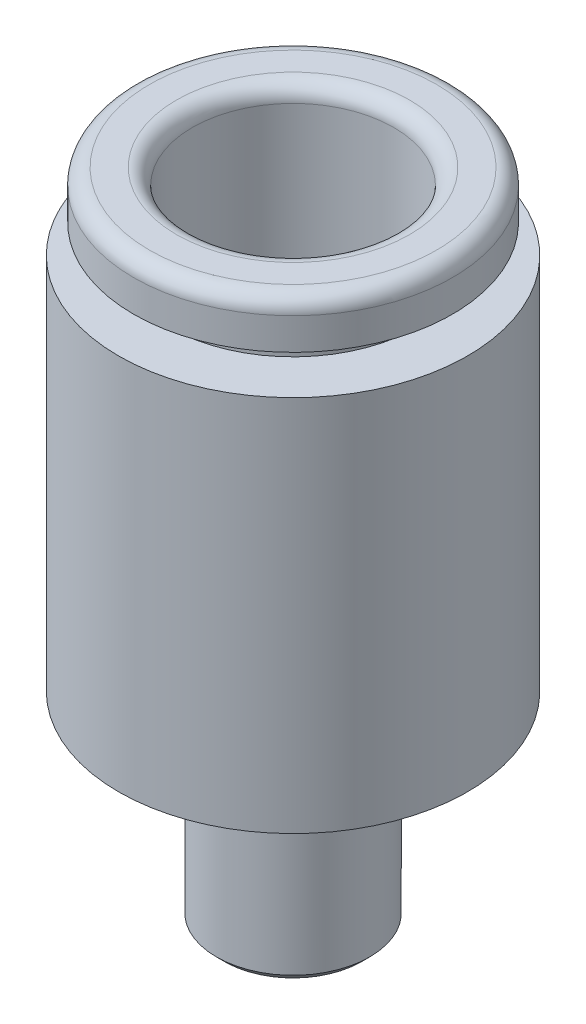
ISO-10303-21;
HEADER;
FILE_DESCRIPTION(('STEP AP214'),'2;1');
FILE_NAME('part.step','',(''),(''),'','','');
FILE_SCHEMA(('AUTOMOTIVE_DESIGN { 1 0 10303 214 1 1 1 1 }'));
ENDSEC;
DATA;
#1=APPLICATION_CONTEXT('core data for automotive mechanical design processes');
#2=APPLICATION_PROTOCOL_DEFINITION('international standard','automotive_design',2000,#1);
#3=PRODUCT_CONTEXT('',#1,'mechanical');
#4=PRODUCT('Part','Part','',(#3));
#5=PRODUCT_RELATED_PRODUCT_CATEGORY('part','',(#4));
#6=PRODUCT_DEFINITION_FORMATION('','',#4);
#7=PRODUCT_DEFINITION_CONTEXT('part definition',#1,'design');
#8=PRODUCT_DEFINITION('design','',#6,#7);
#9=PRODUCT_DEFINITION_SHAPE('','',#8);
#10=(LENGTH_UNIT() NAMED_UNIT(*) SI_UNIT(.MILLI.,.METRE.));
#11=(NAMED_UNIT(*) PLANE_ANGLE_UNIT() SI_UNIT($,.RADIAN.));
#12=(NAMED_UNIT(*) SI_UNIT($,.STERADIAN.) SOLID_ANGLE_UNIT());
#13=UNCERTAINTY_MEASURE_WITH_UNIT(LENGTH_MEASURE(1.E-05),#10,'distance_accuracy_value','');
#14=(GEOMETRIC_REPRESENTATION_CONTEXT(3) GLOBAL_UNCERTAINTY_ASSIGNED_CONTEXT((#13)) GLOBAL_UNIT_ASSIGNED_CONTEXT((#10,
#11,#12)) REPRESENTATION_CONTEXT('',''));
#15=CARTESIAN_POINT('',(0.,0.,0.));
#16=DIRECTION('',(0.,0.,1.));
#17=DIRECTION('',(1.,0.,0.));
#18=AXIS2_PLACEMENT_3D('',#15,#16,#17);
#19=CARTESIAN_POINT('',(0.577350269189625,-15.3,1.));
#20=DIRECTION('',(0.,-1.,0.));
#21=DIRECTION('',(0.,0.,-1.));
#22=AXIS2_PLACEMENT_3D('',#19,#20,#21);
#23=PLANE('',#22);
#24=DIRECTION('',(-1.,0.,0.));
#25=VECTOR('',#24,1.);
#26=CARTESIAN_POINT('',(0.577350269189627,-15.3,-0.930158461016504));
#27=LINE('',#26,#25);
#28=CARTESIAN_POINT('',(0.537027237856888,-15.3,-0.930158461016504));
#29=VERTEX_POINT('',#28);
#30=CARTESIAN_POINT('',(0.,-15.3,-0.930158461016503));
#31=VERTEX_POINT('',#30);
#32=EDGE_CURVE('E146',#29,#31,#27,.T.);
#33=ORIENTED_EDGE('',*,*,#32,.T.);
#34=CARTESIAN_POINT('',(0.,-15.3,0.));
#35=DIRECTION('',(0.,-1.,0.));
#36=DIRECTION('',(0.,0.,-1.));
#37=AXIS2_PLACEMENT_3D('',#34,#35,#36);
#38=CIRCLE('',#37,0.930158461016504);
#39=CARTESIAN_POINT('',(0.80554085678533,-15.3,-0.465079230508252));
#40=VERTEX_POINT('',#39);
#41=EDGE_CURVE('E11',#31,#40,#38,.T.);
#42=ORIENTED_EDGE('',*,*,#41,.T.);
#43=DIRECTION('',(-0.5,0.,-0.866025403784439));
#44=VECTOR('',#43,1.);
#45=CARTESIAN_POINT('',(1.09421599138014,-15.3,0.0349207694917481));
#46=LINE('',#45,#44);
#47=EDGE_CURVE('E153',#40,#29,#46,.T.);
#48=ORIENTED_EDGE('',*,*,#47,.T.);
#49=EDGE_LOOP('',(#33,#42,#48));
#50=FACE_BOUND('',#49,.T.);
#51=ADVANCED_FACE('F34',(#50),#23,.F.);
#52=CARTESIAN_POINT('',(1.07405447571377,-15.3,0.));
#53=VERTEX_POINT('',#52);
#54=EDGE_CURVE('E150',#53,#40,#46,.T.);
#55=ORIENTED_EDGE('',*,*,#54,.T.);
#56=CARTESIAN_POINT('',(0.80554085678533,-15.3,0.465079230508252));
#57=VERTEX_POINT('',#56);
#58=EDGE_CURVE('E43',#40,#57,#38,.T.);
#59=ORIENTED_EDGE('',*,*,#58,.T.);
#60=DIRECTION('',(0.5,0.,-0.866025403784438));
#61=VECTOR('',#60,1.);
#62=CARTESIAN_POINT('',(0.516865722190517,-15.3,0.965079230508253));
#63=LINE('',#62,#61);
#64=EDGE_CURVE('E224',#57,#53,#63,.T.);
#65=ORIENTED_EDGE('',*,*,#64,.T.);
#66=EDGE_LOOP('',(#55,#59,#65));
#67=FACE_BOUND('',#66,.T.);
#68=ADVANCED_FACE('F248',(#67),#23,.F.);
#69=CARTESIAN_POINT('',(0.537027237856886,-15.3,0.930158461016505));
#70=VERTEX_POINT('',#69);
#71=EDGE_CURVE('E120',#70,#57,#63,.T.);
#72=ORIENTED_EDGE('',*,*,#71,.T.);
#73=CARTESIAN_POINT('',(0.,-15.3,0.));
#74=DIRECTION('',(0.,1.,0.));
#75=DIRECTION('',(0.,0.,1.));
#76=AXIS2_PLACEMENT_3D('',#73,#74,#75);
#77=CIRCLE('',#76,0.930158461016504);
#78=CARTESIAN_POINT('',(0.,-15.3,0.930158461016504));
#79=VERTEX_POINT('',#78);
#80=EDGE_CURVE('E106',#79,#57,#77,.T.);
#81=ORIENTED_EDGE('',*,*,#80,.F.);
#82=DIRECTION('',(1.,0.,0.));
#83=VECTOR('',#82,1.);
#84=CARTESIAN_POINT('',(-0.577350269189628,-15.3,0.930158461016504));
#85=LINE('',#84,#83);
#86=EDGE_CURVE('E117',#79,#70,#85,.T.);
#87=ORIENTED_EDGE('',*,*,#86,.T.);
#88=EDGE_LOOP('',(#72,#81,#87));
#89=FACE_BOUND('',#88,.T.);
#90=ADVANCED_FACE('F116',(#89),#23,.F.);
#91=CARTESIAN_POINT('',(-0.537027237856889,-15.3,0.930158461016504));
#92=VERTEX_POINT('',#91);
#93=EDGE_CURVE('E127',#92,#79,#85,.T.);
#94=ORIENTED_EDGE('',*,*,#93,.T.);
#95=CARTESIAN_POINT('',(-0.80554085678533,-15.3,0.465079230508252));
#96=VERTEX_POINT('',#95);
#97=EDGE_CURVE('E103',#79,#96,#38,.T.);
#98=ORIENTED_EDGE('',*,*,#97,.T.);
#99=DIRECTION('',(0.5,0.,0.866025403784439));
#100=VECTOR('',#99,1.);
#101=CARTESIAN_POINT('',(-1.09421599138014,-15.3,-0.0349207694917461));
#102=LINE('',#101,#100);
#103=EDGE_CURVE('E132',#96,#92,#102,.T.);
#104=ORIENTED_EDGE('',*,*,#103,.T.);
#105=EDGE_LOOP('',(#94,#98,#104));
#106=FACE_BOUND('',#105,.T.);
#107=ADVANCED_FACE('F131',(#106),#23,.F.);
#108=CARTESIAN_POINT('',(-1.07405447571377,-15.3,0.));
#109=VERTEX_POINT('',#108);
#110=EDGE_CURVE('E129',#109,#96,#102,.T.);
#111=ORIENTED_EDGE('',*,*,#110,.T.);
#112=CARTESIAN_POINT('',(-0.80554085678533,-15.3,-0.465079230508252));
#113=VERTEX_POINT('',#112);
#114=EDGE_CURVE('E109',#96,#113,#38,.T.);
#115=ORIENTED_EDGE('',*,*,#114,.T.);
#116=DIRECTION('',(-0.5,0.,0.866025403784439));
#117=VECTOR('',#116,1.);
#118=CARTESIAN_POINT('',(-0.516865722190519,-15.3,-0.965079230508251));
#119=LINE('',#118,#117);
#120=EDGE_CURVE('E145',#113,#109,#119,.T.);
#121=ORIENTED_EDGE('',*,*,#120,.T.);
#122=EDGE_LOOP('',(#111,#115,#121));
#123=FACE_BOUND('',#122,.T.);
#124=ADVANCED_FACE('F197',(#123),#23,.F.);
#125=CARTESIAN_POINT('',(0.,0.,0.));
#126=DIRECTION('',(0.,1.,0.));
#127=DIRECTION('',(0.,0.,1.));
#128=AXIS2_PLACEMENT_3D('',#125,#126,#127);
#129=CYLINDRICAL_SURFACE('',#128,3.925);
#130=CARTESIAN_POINT('',(0.,-2.4,0.));
#131=DIRECTION('',(0.,1.,0.));
#132=DIRECTION('',(0.,0.,1.));
#133=AXIS2_PLACEMENT_3D('',#130,#131,#132);
#134=CIRCLE('',#133,3.925);
#135=CARTESIAN_POINT('',(0.,-2.4,3.925));
#136=VERTEX_POINT('',#135);
#137=EDGE_CURVE('E166',#136,#136,#134,.F.);
#138=ORIENTED_EDGE('',*,*,#137,.F.);
#139=EDGE_LOOP('',(#138));
#140=FACE_BOUND('',#139,.T.);
#141=CARTESIAN_POINT('',(0.,-1.5,0.));
#142=DIRECTION('',(0.,1.,0.));
#143=DIRECTION('',(0.,0.,1.));
#144=AXIS2_PLACEMENT_3D('',#141,#142,#143);
#145=CIRCLE('',#144,3.925);
#146=CARTESIAN_POINT('',(0.,-1.5,3.925));
#147=VERTEX_POINT('',#146);
#148=EDGE_CURVE('E178',#147,#147,#145,.T.);
#149=ORIENTED_EDGE('',*,*,#148,.F.);
#150=EDGE_LOOP('',(#149));
#151=FACE_BOUND('',#150,.T.);
#152=ADVANCED_FACE('F312',(#140,#151),#129,.T.);
#153=CARTESIAN_POINT('',(-5.025,-1.5,0.));
#154=DIRECTION('',(0.,-1.,0.));
#155=DIRECTION('',(0.,0.,-1.));
#156=AXIS2_PLACEMENT_3D('',#153,#154,#155);
#157=PLANE('',#156);
#158=ORIENTED_EDGE('',*,*,#148,.T.);
#159=EDGE_LOOP('',(#158));
#160=FACE_BOUND('',#159,.T.);
#161=CARTESIAN_POINT('',(0.,-1.5,0.));
#162=DIRECTION('',(0.,1.,0.));
#163=DIRECTION('',(0.,0.,1.));
#164=AXIS2_PLACEMENT_3D('',#161,#162,#163);
#165=CIRCLE('',#164,5.025);
#166=CARTESIAN_POINT('',(0.,-1.5,5.025));
#167=VERTEX_POINT('',#166);
#168=EDGE_CURVE('E175',#167,#167,#165,.T.);
#169=ORIENTED_EDGE('',*,*,#168,.F.);
#170=EDGE_LOOP('',(#169));
#171=FACE_BOUND('',#170,.T.);
#172=ADVANCED_FACE('F308',(#160,#171),#157,.T.);
#173=CARTESIAN_POINT('',(0.,0.,0.));
#174=DIRECTION('',(0.,1.,0.));
#175=DIRECTION('',(0.,0.,1.));
#176=AXIS2_PLACEMENT_3D('',#173,#174,#175);
#177=CYLINDRICAL_SURFACE('',#176,5.025);
#178=ORIENTED_EDGE('',*,*,#168,.T.);
#179=EDGE_LOOP('',(#178));
#180=FACE_BOUND('',#179,.T.);
#181=CARTESIAN_POINT('',(0.,-0.500000000000001,0.));
#182=DIRECTION('',(0.,1.,0.));
#183=DIRECTION('',(0.,0.,1.));
#184=AXIS2_PLACEMENT_3D('',#181,#182,#183);
#185=CIRCLE('',#184,5.025);
#186=CARTESIAN_POINT('',(0.,-0.500000000000001,5.025));
#187=VERTEX_POINT('',#186);
#188=EDGE_CURVE('E172',#187,#187,#185,.T.);
#189=ORIENTED_EDGE('',*,*,#188,.F.);
#190=EDGE_LOOP('',(#189));
#191=FACE_BOUND('',#190,.T.);
#192=ADVANCED_FACE('F304',(#180,#191),#177,.T.);
#193=CARTESIAN_POINT('',(0.,-0.500000000000001,0.));
#194=DIRECTION('',(0.,1.,0.));
#195=DIRECTION('',(0.,0.,1.));
#196=AXIS2_PLACEMENT_3D('',#193,#194,#195);
#197=TOROIDAL_SURFACE('',#196,4.525,0.5);
#198=ORIENTED_EDGE('',*,*,#188,.T.);
#199=EDGE_LOOP('',(#198));
#200=FACE_BOUND('',#199,.T.);
#201=CARTESIAN_POINT('',(0.,0.,0.));
#202=DIRECTION('',(0.,1.,0.));
#203=DIRECTION('',(0.,0.,1.));
#204=AXIS2_PLACEMENT_3D('',#201,#202,#203);
#205=CIRCLE('',#204,4.525);
#206=CARTESIAN_POINT('',(0.,0.,4.525));
#207=VERTEX_POINT('',#206);
#208=EDGE_CURVE('E169',#207,#207,#205,.T.);
#209=ORIENTED_EDGE('',*,*,#208,.F.);
#210=EDGE_LOOP('',(#209));
#211=FACE_BOUND('',#210,.T.);
#212=ADVANCED_FACE('F301',(#200,#211),#197,.T.);
#213=CARTESIAN_POINT('',(0.,0.,0.));
#214=DIRECTION('',(0.,1.,0.));
#215=DIRECTION('',(0.,0.,1.));
#216=AXIS2_PLACEMENT_3D('',#213,#214,#215);
#217=PLANE('',#216);
#218=CARTESIAN_POINT('',(0.,0.,0.));
#219=DIRECTION('',(0.,1.,0.));
#220=DIRECTION('',(0.,0.,1.));
#221=AXIS2_PLACEMENT_3D('',#218,#219,#220);
#222=CIRCLE('',#221,3.675);
#223=CARTESIAN_POINT('',(0.,0.,3.675));
#224=VERTEX_POINT('',#223);
#225=EDGE_CURVE('E189',#224,#224,#222,.F.);
#226=ORIENTED_EDGE('',*,*,#225,.T.);
#227=EDGE_LOOP('',(#226));
#228=FACE_BOUND('',#227,.T.);
#229=ORIENTED_EDGE('',*,*,#208,.T.);
#230=EDGE_LOOP('',(#229));
#231=FACE_BOUND('',#230,.T.);
#232=ADVANCED_FACE('F297',(#228,#231),#217,.T.);
#233=CARTESIAN_POINT('',(0.,-29.856349186104,0.));
#234=DIRECTION('',(0.,1.,0.));
#235=DIRECTION('',(0.,0.,1.));
#236=AXIS2_PLACEMENT_3D('',#233,#234,#235);
#237=CYLINDRICAL_SURFACE('',#236,5.5);
#238=CARTESIAN_POINT('',(0.,-14.3,0.));
#239=DIRECTION('',(0.,1.,0.));
#240=DIRECTION('',(0.,0.,1.));
#241=AXIS2_PLACEMENT_3D('',#238,#239,#240);
#242=CIRCLE('',#241,5.5);
#243=CARTESIAN_POINT('',(0.,-14.3,5.5));
#244=VERTEX_POINT('',#243);
#245=EDGE_CURVE('E163',#244,#244,#242,.F.);
#246=ORIENTED_EDGE('',*,*,#245,.F.);
#247=EDGE_LOOP('',(#246));
#248=FACE_BOUND('',#247,.T.);
#249=CARTESIAN_POINT('',(0.,-2.4,0.));
#250=DIRECTION('',(0.,1.,0.));
#251=DIRECTION('',(0.,0.,1.));
#252=AXIS2_PLACEMENT_3D('',#249,#250,#251);
#253=CIRCLE('',#252,5.5);
#254=CARTESIAN_POINT('',(0.,-2.4,5.5));
#255=VERTEX_POINT('',#254);
#256=EDGE_CURVE('E160',#255,#255,#253,.T.);
#257=ORIENTED_EDGE('',*,*,#256,.F.);
#258=EDGE_LOOP('',(#257));
#259=FACE_BOUND('',#258,.T.);
#260=ADVANCED_FACE('F293',(#248,#259),#237,.T.);
#261=CARTESIAN_POINT('',(0.,-2.4,0.));
#262=DIRECTION('',(0.,1.,0.));
#263=DIRECTION('',(0.,0.,1.));
#264=AXIS2_PLACEMENT_3D('',#261,#262,#263);
#265=PLANE('',#264);
#266=ORIENTED_EDGE('',*,*,#137,.T.);
#267=EDGE_LOOP('',(#266));
#268=FACE_BOUND('',#267,.T.);
#269=ORIENTED_EDGE('',*,*,#256,.T.);
#270=EDGE_LOOP('',(#269));
#271=FACE_BOUND('',#270,.T.);
#272=ADVANCED_FACE('F289',(#268,#271),#265,.T.);
#273=CARTESIAN_POINT('',(0.,-14.3,0.));
#274=DIRECTION('',(0.,1.,0.));
#275=DIRECTION('',(0.,0.,1.));
#276=AXIS2_PLACEMENT_3D('',#273,#274,#275);
#277=PLANE('',#276);
#278=CARTESIAN_POINT('',(0.,-14.3,0.));
#279=DIRECTION('',(0.,1.,0.));
#280=DIRECTION('',(0.,0.,1.));
#281=AXIS2_PLACEMENT_3D('',#278,#279,#280);
#282=CIRCLE('',#281,2.41500000000002);
#283=CARTESIAN_POINT('',(0.,-14.3,2.41500000000002));
#284=VERTEX_POINT('',#283);
#285=EDGE_CURVE('E157',#284,#284,#282,.T.);
#286=ORIENTED_EDGE('',*,*,#285,.T.);
#287=EDGE_LOOP('',(#286));
#288=FACE_BOUND('',#287,.T.);
#289=ORIENTED_EDGE('',*,*,#245,.T.);
#290=EDGE_LOOP('',(#289));
#291=FACE_BOUND('',#290,.T.);
#292=ADVANCED_FACE('F286',(#288,#291),#277,.F.);
#293=CARTESIAN_POINT('',(-2.415,-20.6,0.));
#294=DIRECTION('',(0.,-1.,0.));
#295=DIRECTION('',(0.,0.,-1.));
#296=AXIS2_PLACEMENT_3D('',#293,#294,#295);
#297=PLANE('',#296);
#298=CARTESIAN_POINT('',(0.,-20.6,0.));
#299=DIRECTION('',(0.,1.,0.));
#300=DIRECTION('',(0.,0.,1.));
#301=AXIS2_PLACEMENT_3D('',#298,#299,#300);
#302=CIRCLE('',#301,0.930158461016504);
#303=CARTESIAN_POINT('',(0.,-20.6,0.930158461016504));
#304=VERTEX_POINT('',#303);
#305=EDGE_CURVE('E121',#304,#304,#302,.T.);
#306=ORIENTED_EDGE('',*,*,#305,.T.);
#307=EDGE_LOOP('',(#306));
#308=FACE_BOUND('',#307,.T.);
#309=CARTESIAN_POINT('',(0.,-20.6,0.));
#310=DIRECTION('',(0.,-1.,0.));
#311=DIRECTION('',(0.,0.,-1.));
#312=AXIS2_PLACEMENT_3D('',#309,#310,#311);
#313=CIRCLE('',#312,2.165);
#314=CARTESIAN_POINT('',(0.,-20.6,-2.165));
#315=VERTEX_POINT('',#314);
#316=EDGE_CURVE('E184',#315,#315,#313,.T.);
#317=ORIENTED_EDGE('',*,*,#316,.T.);
#318=EDGE_LOOP('',(#317));
#319=FACE_BOUND('',#318,.T.);
#320=ADVANCED_FACE('F237',(#308,#319),#297,.T.);
#321=CARTESIAN_POINT('',(0.,0.,0.));
#322=DIRECTION('',(0.,1.,0.));
#323=DIRECTION('',(0.,0.,1.));
#324=AXIS2_PLACEMENT_3D('',#321,#322,#323);
#325=CYLINDRICAL_SURFACE('',#324,2.41500000000001);
#326=CARTESIAN_POINT('',(0.,-20.35,0.));
#327=DIRECTION('',(0.,-1.,0.));
#328=DIRECTION('',(0.,0.,-1.));
#329=AXIS2_PLACEMENT_3D('',#326,#327,#328);
#330=CIRCLE('',#329,2.41500000000001);
#331=CARTESIAN_POINT('',(0.,-20.35,-2.41500000000001));
#332=VERTEX_POINT('',#331);
#333=EDGE_CURVE('E181',#332,#332,#330,.F.);
#334=ORIENTED_EDGE('',*,*,#333,.T.);
#335=EDGE_LOOP('',(#334));
#336=FACE_BOUND('',#335,.T.);
#337=ORIENTED_EDGE('',*,*,#285,.F.);
#338=EDGE_LOOP('',(#337));
#339=FACE_BOUND('',#338,.T.);
#340=ADVANCED_FACE('F280',(#336,#339),#325,.T.);
#341=CARTESIAN_POINT('',(0.,-20.35,0.));
#342=DIRECTION('',(0.,1.,0.));
#343=DIRECTION('',(0.,0.,1.));
#344=AXIS2_PLACEMENT_3D('',#341,#342,#343);
#345=CONICAL_SURFACE('',#344,2.41500000000001,0.785398163397447);
#346=ORIENTED_EDGE('',*,*,#316,.F.);
#347=EDGE_LOOP('',(#346));
#348=FACE_BOUND('',#347,.T.);
#349=ORIENTED_EDGE('',*,*,#333,.F.);
#350=EDGE_LOOP('',(#349));
#351=FACE_BOUND('',#350,.T.);
#352=ADVANCED_FACE('F278',(#348,#351),#345,.T.);
#353=CARTESIAN_POINT('',(0.,-22.2802561210692,0.));
#354=DIRECTION('',(0.,1.,0.));
#355=DIRECTION('',(0.,0.,1.));
#356=AXIS2_PLACEMENT_3D('',#353,#354,#355);
#357=CYLINDRICAL_SURFACE('',#356,3.175);
#358=CARTESIAN_POINT('',(0.,-0.5,0.));
#359=DIRECTION('',(0.,1.,0.));
#360=DIRECTION('',(0.,0.,1.));
#361=AXIS2_PLACEMENT_3D('',#358,#359,#360);
#362=CIRCLE('',#361,3.175);
#363=CARTESIAN_POINT('',(0.,-0.5,3.175));
#364=VERTEX_POINT('',#363);
#365=EDGE_CURVE('E187',#364,#364,#362,.T.);
#366=CARTESIAN_POINT('',(0.,-13.3,0.));
#367=DIRECTION('',(0.,1.,0.));
#368=DIRECTION('',(0.,0.,1.));
#369=AXIS2_PLACEMENT_3D('',#366,#367,#368);
#370=CIRCLE('',#369,3.175);
#371=CARTESIAN_POINT('',(0.,-13.3,3.175));
#372=VERTEX_POINT('',#371);
#373=EDGE_CURVE('E154',#372,#372,#370,.F.);
#374=CARTESIAN_POINT('',(0.,-0.5,3.175));
#375=CARTESIAN_POINT('',(0.,-0.633333333333334,3.175));
#376=CARTESIAN_POINT('',(0.,-0.766666666666668,3.175));
#377=CARTESIAN_POINT('',(0.,-1.03333333333333,3.175));
#378=CARTESIAN_POINT('',(0.,-1.16666666666667,3.175));
#379=CARTESIAN_POINT('',(0.,-1.43333333333333,3.175));
#380=CARTESIAN_POINT('',(0.,-1.56666666666667,3.175));
#381=CARTESIAN_POINT('',(0.,-1.83333333333333,3.175));
#382=CARTESIAN_POINT('',(0.,-1.96666666666667,3.175));
#383=CARTESIAN_POINT('',(0.,-2.23333333333334,3.175));
#384=CARTESIAN_POINT('',(0.,-2.36666666666667,3.175));
#385=CARTESIAN_POINT('',(0.,-2.63333333333333,3.175));
#386=CARTESIAN_POINT('',(0.,-2.76666666666667,3.175));
#387=CARTESIAN_POINT('',(0.,-3.03333333333333,3.175));
#388=CARTESIAN_POINT('',(0.,-3.16666666666667,3.175));
#389=CARTESIAN_POINT('',(0.,-3.43333333333333,3.175));
#390=CARTESIAN_POINT('',(0.,-3.56666666666667,3.175));
#391=CARTESIAN_POINT('',(0.,-3.83333333333333,3.175));
#392=CARTESIAN_POINT('',(0.,-3.96666666666667,3.175));
#393=CARTESIAN_POINT('',(0.,-4.23333333333333,3.175));
#394=CARTESIAN_POINT('',(0.,-4.36666666666667,3.175));
#395=CARTESIAN_POINT('',(0.,-4.63333333333333,3.175));
#396=CARTESIAN_POINT('',(0.,-4.76666666666667,3.175));
#397=CARTESIAN_POINT('',(0.,-5.03333333333333,3.175));
#398=CARTESIAN_POINT('',(0.,-5.16666666666667,3.175));
#399=CARTESIAN_POINT('',(0.,-5.43333333333333,3.175));
#400=CARTESIAN_POINT('',(0.,-5.56666666666667,3.175));
#401=CARTESIAN_POINT('',(0.,-5.83333333333333,3.175));
#402=CARTESIAN_POINT('',(0.,-5.96666666666667,3.175));
#403=CARTESIAN_POINT('',(0.,-6.23333333333333,3.175));
#404=CARTESIAN_POINT('',(0.,-6.36666666666667,3.175));
#405=CARTESIAN_POINT('',(0.,-6.63333333333333,3.175));
#406=CARTESIAN_POINT('',(0.,-6.76666666666667,3.175));
#407=CARTESIAN_POINT('',(0.,-7.03333333333333,3.175));
#408=CARTESIAN_POINT('',(0.,-7.16666666666667,3.175));
#409=CARTESIAN_POINT('',(0.,-7.43333333333333,3.175));
#410=CARTESIAN_POINT('',(0.,-7.56666666666667,3.175));
#411=CARTESIAN_POINT('',(0.,-7.83333333333333,3.175));
#412=CARTESIAN_POINT('',(0.,-7.96666666666667,3.175));
#413=CARTESIAN_POINT('',(0.,-8.23333333333333,3.175));
#414=CARTESIAN_POINT('',(0.,-8.36666666666667,3.175));
#415=CARTESIAN_POINT('',(0.,-8.63333333333333,3.175));
#416=CARTESIAN_POINT('',(0.,-8.76666666666667,3.175));
#417=CARTESIAN_POINT('',(0.,-9.03333333333333,3.175));
#418=CARTESIAN_POINT('',(0.,-9.16666666666667,3.175));
#419=CARTESIAN_POINT('',(0.,-9.43333333333333,3.175));
#420=CARTESIAN_POINT('',(0.,-9.56666666666667,3.175));
#421=CARTESIAN_POINT('',(0.,-9.83333333333333,3.175));
#422=CARTESIAN_POINT('',(0.,-9.96666666666667,3.175));
#423=CARTESIAN_POINT('',(0.,-10.2333333333333,3.175));
#424=CARTESIAN_POINT('',(0.,-10.3666666666667,3.175));
#425=CARTESIAN_POINT('',(0.,-10.6333333333333,3.175));
#426=CARTESIAN_POINT('',(0.,-10.7666666666667,3.175));
#427=CARTESIAN_POINT('',(0.,-11.0333333333333,3.175));
#428=CARTESIAN_POINT('',(0.,-11.1666666666667,3.175));
#429=CARTESIAN_POINT('',(0.,-11.4333333333333,3.175));
#430=CARTESIAN_POINT('',(0.,-11.5666666666667,3.175));
#431=CARTESIAN_POINT('',(0.,-11.8333333333333,3.175));
#432=CARTESIAN_POINT('',(0.,-11.9666666666667,3.175));
#433=CARTESIAN_POINT('',(0.,-12.2333333333333,3.175));
#434=CARTESIAN_POINT('',(0.,-12.3666666666667,3.175));
#435=CARTESIAN_POINT('',(0.,-12.6333333333333,3.175));
#436=CARTESIAN_POINT('',(0.,-12.7666666666667,3.175));
#437=CARTESIAN_POINT('',(0.,-13.0333333333333,3.175));
#438=CARTESIAN_POINT('',(0.,-13.1666666666667,3.175));
#439=CARTESIAN_POINT('',(0.,-13.3,3.175));
#440=B_SPLINE_CURVE_WITH_KNOTS('',3,(#374,#375,#376,#377,#378,#379,#380,#381,#382,#383,#384,
#385,#386,#387,#388,#389,#390,#391,#392,#393,#394,#395,#396,#397,#398,#399,#400,#401,#402,#403,
#404,#405,#406,#407,#408,#409,#410,#411,#412,#413,#414,#415,#416,#417,#418,#419,#420,#421,#422,
#423,#424,#425,#426,#427,#428,#429,#430,#431,#432,#433,#434,#435,#436,#437,#438,#439),
.UNSPECIFIED.,.F.,.F.,(4,2,2,2,2,2,2,2,2,2,2,2,2,2,2,2,2,2,2,2,2,2,2,2,2,2,2,2,2,2,2,2,4),(0.,
0.400000000000001,0.799999999999999,1.2,1.6,2.,2.4,2.8,3.2,3.6,4.,4.4,4.8,5.2,5.6,6.,6.4,6.8,
7.2,7.6,8.,8.4,8.8,9.2,9.6,10.,10.4,10.8,11.2,11.6,12.,12.4,12.8),.UNSPECIFIED.);
#441=EDGE_CURVE('BSEAM274',#364,#372,#440,.T.);
#442=ORIENTED_EDGE('',*,*,#365,.T.);
#443=ORIENTED_EDGE('',*,*,#373,.T.);
#444=ORIENTED_EDGE('',*,*,#441,.T.);
#445=ORIENTED_EDGE('',*,*,#441,.F.);
#446=EDGE_LOOP('',(#442,#444,#443,#445));
#447=FACE_BOUND('',#446,.T.);
#448=ADVANCED_FACE('F274',(#447),#357,.F.);
#449=CARTESIAN_POINT('',(0.,-13.3,0.));
#450=DIRECTION('',(0.,1.,0.));
#451=DIRECTION('',(0.,0.,1.));
#452=AXIS2_PLACEMENT_3D('',#449,#450,#451);
#453=PLANE('',#452);
#454=DIRECTION('',(0.5,0.,-0.866025403784438));
#455=VECTOR('',#454,1.);
#456=CARTESIAN_POINT('',(0.577350269189625,-13.3,1.));
#457=LINE('',#456,#455);
#458=CARTESIAN_POINT('',(0.577350269189625,-13.3,1.));
#459=VERTEX_POINT('',#458);
#460=CARTESIAN_POINT('',(1.15470053837925,-13.3,0.));
#461=VERTEX_POINT('',#460);
#462=EDGE_CURVE('E56',#459,#461,#457,.T.);
#463=ORIENTED_EDGE('',*,*,#462,.F.);
#464=DIRECTION('',(1.,0.,0.));
#465=VECTOR('',#464,1.);
#466=CARTESIAN_POINT('',(-0.577350269189628,-13.3,1.));
#467=LINE('',#466,#465);
#468=CARTESIAN_POINT('',(-0.577350269189628,-13.3,1.));
#469=VERTEX_POINT('',#468);
#470=EDGE_CURVE('E222',#469,#459,#467,.T.);
#471=ORIENTED_EDGE('',*,*,#470,.F.);
#472=DIRECTION('',(0.5,0.,0.866025403784439));
#473=VECTOR('',#472,1.);
#474=CARTESIAN_POINT('',(-1.15470053837925,-13.3,0.));
#475=LINE('',#474,#473);
#476=CARTESIAN_POINT('',(-1.15470053837925,-13.3,0.));
#477=VERTEX_POINT('',#476);
#478=EDGE_CURVE('E225',#477,#469,#475,.T.);
#479=ORIENTED_EDGE('',*,*,#478,.F.);
#480=DIRECTION('',(-0.5,0.,0.866025403784439));
#481=VECTOR('',#480,1.);
#482=CARTESIAN_POINT('',(-0.577350269189627,-13.3,-0.999999999999998));
#483=LINE('',#482,#481);
#484=CARTESIAN_POINT('',(-0.577350269189627,-13.3,-0.999999999999998));
#485=VERTEX_POINT('',#484);
#486=EDGE_CURVE('E227',#485,#477,#483,.T.);
#487=ORIENTED_EDGE('',*,*,#486,.F.);
#488=DIRECTION('',(-1.,0.,0.));
#489=VECTOR('',#488,1.);
#490=CARTESIAN_POINT('',(0.577350269189627,-13.3,-0.999999999999999));
#491=LINE('',#490,#489);
#492=CARTESIAN_POINT('',(0.577350269189627,-13.3,-0.999999999999999));
#493=VERTEX_POINT('',#492);
#494=EDGE_CURVE('E213',#493,#485,#491,.T.);
#495=ORIENTED_EDGE('',*,*,#494,.F.);
#496=DIRECTION('',(-0.5,0.,-0.866025403784439));
#497=VECTOR('',#496,1.);
#498=CARTESIAN_POINT('',(1.15470053837925,-13.3,0.));
#499=LINE('',#498,#497);
#500=EDGE_CURVE('E230',#461,#493,#499,.T.);
#501=ORIENTED_EDGE('',*,*,#500,.F.);
#502=EDGE_LOOP('',(#463,#471,#479,#487,#495,#501));
#503=FACE_BOUND('',#502,.T.);
#504=ORIENTED_EDGE('',*,*,#373,.F.);
#505=EDGE_LOOP('',(#504));
#506=FACE_BOUND('',#505,.T.);
#507=ADVANCED_FACE('F271',(#503,#506),#453,.T.);
#508=CARTESIAN_POINT('',(0.,-0.5,0.));
#509=DIRECTION('',(0.,1.,0.));
#510=DIRECTION('',(0.,0.,1.));
#511=AXIS2_PLACEMENT_3D('',#508,#509,#510);
#512=TOROIDAL_SURFACE('',#511,3.675,0.5);
#513=ORIENTED_EDGE('',*,*,#225,.F.);
#514=EDGE_LOOP('',(#513));
#515=FACE_BOUND('',#514,.T.);
#516=ORIENTED_EDGE('',*,*,#365,.F.);
#517=EDGE_LOOP('',(#516));
#518=FACE_BOUND('',#517,.T.);
#519=ADVANCED_FACE('F36',(#515,#518),#512,.T.);
#520=CARTESIAN_POINT('',(0.577350269189625,-13.3,1.));
#521=DIRECTION('',(0.865497844507676,-0.034899496702501,0.499695413509548));
#522=DIRECTION('',(0.5,0.,-0.866025403784438));
#523=AXIS2_PLACEMENT_3D('',#520,#521,#522);
#524=PLANE('',#523);
#525=ORIENTED_EDGE('',*,*,#462,.T.);
#526=DIRECTION('',(0.0402902897014406,0.999188016619382,0.));
#527=VECTOR('',#526,1.);
#528=CARTESIAN_POINT('',(1.15376332138935,-13.3232427215644,0.));
#529=LINE('',#528,#527);
#530=EDGE_CURVE('E134',#53,#461,#529,.T.);
#531=ORIENTED_EDGE('',*,*,#530,.F.);
#532=ORIENTED_EDGE('',*,*,#64,.F.);
#533=ORIENTED_EDGE('',*,*,#71,.F.);
#534=DIRECTION('',(0.0201451448507203,0.999188016619382,0.0348924144072821));
#535=VECTOR('',#534,1.);
#536=CARTESIAN_POINT('',(0.576881660694675,-13.3232427215644,0.999188346277887));
#537=LINE('',#536,#535);
#538=EDGE_CURVE('E128',#70,#459,#537,.T.);
#539=ORIENTED_EDGE('',*,*,#538,.T.);
#540=EDGE_LOOP('',(#525,#531,#532,#533,#539));
#541=FACE_BOUND('',#540,.T.);
#542=ADVANCED_FACE('F255',(#541),#524,.F.);
#543=CARTESIAN_POINT('',(-0.577350269189628,-13.3,1.));
#544=DIRECTION('',(0.,-0.034899496702501,0.999390827019096));
#545=DIRECTION('',(0.,-0.999390827019096,-0.034899496702501));
#546=AXIS2_PLACEMENT_3D('',#543,#544,#545);
#547=PLANE('',#546);
#548=ORIENTED_EDGE('',*,*,#470,.T.);
#549=ORIENTED_EDGE('',*,*,#538,.F.);
#550=ORIENTED_EDGE('',*,*,#86,.F.);
#551=ORIENTED_EDGE('',*,*,#93,.F.);
#552=DIRECTION('',(-0.0201451448507203,0.999188016619382,0.0348924144072821));
#553=VECTOR('',#552,1.);
#554=CARTESIAN_POINT('',(-0.576881660694678,-13.3232427215644,0.999188346277887));
#555=LINE('',#554,#553);
#556=EDGE_CURVE('E216',#92,#469,#555,.T.);
#557=ORIENTED_EDGE('',*,*,#556,.T.);
#558=EDGE_LOOP('',(#548,#549,#550,#551,#557));
#559=FACE_BOUND('',#558,.T.);
#560=ADVANCED_FACE('F126',(#559),#547,.F.);
#561=CARTESIAN_POINT('',(-1.15470053837925,-13.3,0.));
#562=DIRECTION('',(-0.865497844507677,-0.034899496702501,0.499695413509547));
#563=DIRECTION('',(0.5,0.,0.866025403784439));
#564=AXIS2_PLACEMENT_3D('',#561,#562,#563);
#565=PLANE('',#564);
#566=ORIENTED_EDGE('',*,*,#478,.T.);
#567=ORIENTED_EDGE('',*,*,#556,.F.);
#568=ORIENTED_EDGE('',*,*,#103,.F.);
#569=ORIENTED_EDGE('',*,*,#110,.F.);
#570=DIRECTION('',(-0.0402902897014406,0.999188016619382,0.));
#571=VECTOR('',#570,1.);
#572=CARTESIAN_POINT('',(-1.15376332138935,-13.3232427215644,0.));
#573=LINE('',#572,#571);
#574=EDGE_CURVE('E204',#109,#477,#573,.T.);
#575=ORIENTED_EDGE('',*,*,#574,.T.);
#576=EDGE_LOOP('',(#566,#567,#568,#569,#575));
#577=FACE_BOUND('',#576,.T.);
#578=ADVANCED_FACE('F265',(#577),#565,.F.);
#579=CARTESIAN_POINT('',(-0.577350269189627,-13.3,-0.999999999999998));
#580=DIRECTION('',(-0.865497844507677,-0.034899496702501,-0.499695413509548));
#581=DIRECTION('',(-0.5,0.,0.866025403784439));
#582=AXIS2_PLACEMENT_3D('',#579,#580,#581);
#583=PLANE('',#582);
#584=ORIENTED_EDGE('',*,*,#486,.T.);
#585=ORIENTED_EDGE('',*,*,#574,.F.);
#586=ORIENTED_EDGE('',*,*,#120,.F.);
#587=CARTESIAN_POINT('',(-0.537027237856888,-15.3,-0.930158461016503));
#588=VERTEX_POINT('',#587);
#589=EDGE_CURVE('E142',#588,#113,#119,.T.);
#590=ORIENTED_EDGE('',*,*,#589,.F.);
#591=DIRECTION('',(-0.0201451448507203,0.999188016619382,-0.0348924144072821));
#592=VECTOR('',#591,1.);
#593=CARTESIAN_POINT('',(-0.576881660694676,-13.3232427215644,-0.999188346277885));
#594=LINE('',#593,#592);
#595=EDGE_CURVE('E210',#588,#485,#594,.T.);
#596=ORIENTED_EDGE('',*,*,#595,.T.);
#597=EDGE_LOOP('',(#584,#585,#586,#590,#596));
#598=FACE_BOUND('',#597,.T.);
#599=ADVANCED_FACE('F203',(#598),#583,.F.);
#600=CARTESIAN_POINT('',(0.577350269189627,-13.3,-0.999999999999999));
#601=DIRECTION('',(0.,-0.034899496702501,-0.999390827019096));
#602=DIRECTION('',(0.,0.999390827019096,-0.034899496702501));
#603=AXIS2_PLACEMENT_3D('',#600,#601,#602);
#604=PLANE('',#603);
#605=ORIENTED_EDGE('',*,*,#494,.T.);
#606=ORIENTED_EDGE('',*,*,#595,.F.);
#607=EDGE_CURVE('E149',#31,#588,#27,.T.);
#608=ORIENTED_EDGE('',*,*,#607,.F.);
#609=ORIENTED_EDGE('',*,*,#32,.F.);
#610=DIRECTION('',(0.0201451448507203,0.999188016619382,-0.0348924144072821));
#611=VECTOR('',#610,1.);
#612=CARTESIAN_POINT('',(0.576881660694676,-13.3232427215644,-0.999188346277886));
#613=LINE('',#612,#611);
#614=EDGE_CURVE('E135',#29,#493,#613,.T.);
#615=ORIENTED_EDGE('',*,*,#614,.T.);
#616=EDGE_LOOP('',(#605,#606,#608,#609,#615));
#617=FACE_BOUND('',#616,.T.);
#618=ADVANCED_FACE('F211',(#617),#604,.F.);
#619=CARTESIAN_POINT('',(1.15470053837925,-13.3,0.));
#620=DIRECTION('',(0.865497844507677,-0.034899496702501,-0.499695413509548));
#621=DIRECTION('',(-0.5,0.,-0.866025403784439));
#622=AXIS2_PLACEMENT_3D('',#619,#620,#621);
#623=PLANE('',#622);
#624=ORIENTED_EDGE('',*,*,#500,.T.);
#625=ORIENTED_EDGE('',*,*,#614,.F.);
#626=ORIENTED_EDGE('',*,*,#47,.F.);
#627=ORIENTED_EDGE('',*,*,#54,.F.);
#628=ORIENTED_EDGE('',*,*,#530,.T.);
#629=EDGE_LOOP('',(#624,#625,#626,#627,#628));
#630=FACE_BOUND('',#629,.T.);
#631=ADVANCED_FACE('F245',(#630),#623,.F.);
#632=ORIENTED_EDGE('',*,*,#589,.T.);
#633=EDGE_CURVE('E38',#113,#31,#38,.T.);
#634=ORIENTED_EDGE('',*,*,#633,.T.);
#635=ORIENTED_EDGE('',*,*,#607,.T.);
#636=EDGE_LOOP('',(#632,#634,#635));
#637=FACE_BOUND('',#636,.T.);
#638=ADVANCED_FACE('F205',(#637),#23,.F.);
#639=CARTESIAN_POINT('',(0.,-20.6,0.));
#640=DIRECTION('',(0.,1.,0.));
#641=DIRECTION('',(0.,0.,1.));
#642=AXIS2_PLACEMENT_3D('',#639,#640,#641);
#643=CYLINDRICAL_SURFACE('',#642,0.930158461016504);
#644=ORIENTED_EDGE('',*,*,#305,.F.);
#645=EDGE_LOOP('',(#644));
#646=FACE_BOUND('',#645,.T.);
#647=ORIENTED_EDGE('',*,*,#80,.T.);
#648=ORIENTED_EDGE('',*,*,#58,.F.);
#649=ORIENTED_EDGE('',*,*,#41,.F.);
#650=ORIENTED_EDGE('',*,*,#633,.F.);
#651=ORIENTED_EDGE('',*,*,#114,.F.);
#652=ORIENTED_EDGE('',*,*,#97,.F.);
#653=EDGE_LOOP('',(#647,#648,#649,#650,#651,#652));
#654=FACE_BOUND('',#653,.T.);
#655=ADVANCED_FACE('F105',(#646,#654),#643,.F.);
#656=CLOSED_SHELL('',(#51,#68,#90,#107,#124,#152,#172,#192,#212,#232,#260,#272,#292,#320,#340,
#352,#448,#507,#519,#542,#560,#578,#599,#618,#631,#638,#655));
#657=MANIFOLD_SOLID_BREP('B2',#656);
#658=ADVANCED_BREP_SHAPE_REPRESENTATION('',(#18,#657),#14);
#659=SHAPE_DEFINITION_REPRESENTATION(#9,#658);
ENDSEC;
END-ISO-10303-21;
